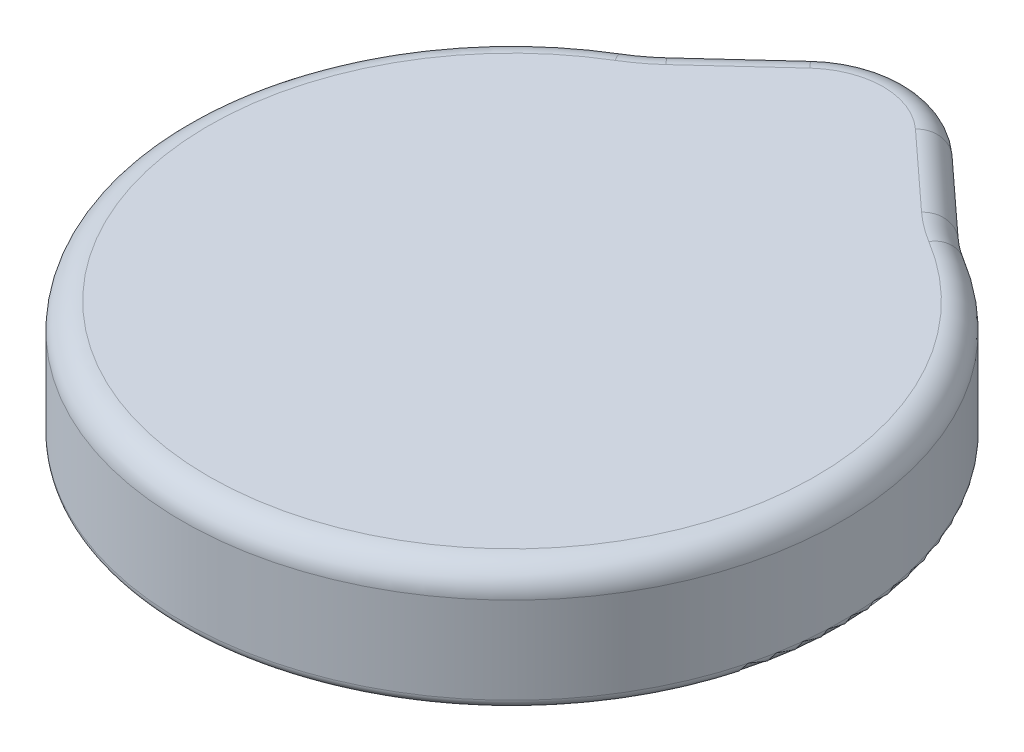
ISO-10303-21;
HEADER;
FILE_DESCRIPTION(('STEP AP214'),'2;1');
FILE_NAME('part.step','',(''),(''),'','','');
FILE_SCHEMA(('AUTOMOTIVE_DESIGN { 1 0 10303 214 1 1 1 1 }'));
ENDSEC;
DATA;
#1=APPLICATION_CONTEXT('core data for automotive mechanical design processes');
#2=APPLICATION_PROTOCOL_DEFINITION('international standard','automotive_design',2000,#1);
#3=PRODUCT_CONTEXT('',#1,'mechanical');
#4=PRODUCT('Part','Part','',(#3));
#5=PRODUCT_RELATED_PRODUCT_CATEGORY('part','',(#4));
#6=PRODUCT_DEFINITION_FORMATION('','',#4);
#7=PRODUCT_DEFINITION_CONTEXT('part definition',#1,'design');
#8=PRODUCT_DEFINITION('design','',#6,#7);
#9=PRODUCT_DEFINITION_SHAPE('','',#8);
#10=(LENGTH_UNIT() NAMED_UNIT(*) SI_UNIT(.MILLI.,.METRE.));
#11=(NAMED_UNIT(*) PLANE_ANGLE_UNIT() SI_UNIT($,.RADIAN.));
#12=(NAMED_UNIT(*) SI_UNIT($,.STERADIAN.) SOLID_ANGLE_UNIT());
#13=UNCERTAINTY_MEASURE_WITH_UNIT(LENGTH_MEASURE(1.E-05),#10,'distance_accuracy_value','');
#14=(GEOMETRIC_REPRESENTATION_CONTEXT(3) GLOBAL_UNCERTAINTY_ASSIGNED_CONTEXT((#13)) GLOBAL_UNIT_ASSIGNED_CONTEXT((#10,
#11,#12)) REPRESENTATION_CONTEXT('',''));
#15=CARTESIAN_POINT('',(0.,0.,0.));
#16=DIRECTION('',(0.,0.,1.));
#17=DIRECTION('',(1.,0.,0.));
#18=AXIS2_PLACEMENT_3D('',#15,#16,#17);
#19=CARTESIAN_POINT('',(-28.9407875302166,-10.,-47.9419525794565));
#20=DIRECTION('',(0.,1.,0.));
#21=DIRECTION('',(0.,0.,1.));
#22=AXIS2_PLACEMENT_3D('',#19,#20,#21);
#23=CYLINDRICAL_SURFACE('',#22,18.);
#24=DIRECTION('',(0.,1.,0.));
#25=VECTOR('',#24,1.);
#26=CARTESIAN_POINT('',(-16.7643043523353,-10.,-34.6855104693437));
#27=LINE('',#26,#25);
#28=CARTESIAN_POINT('',(-16.7643043523353,-9.,-34.6855104693437));
#29=VERTEX_POINT('',#28);
#30=CARTESIAN_POINT('',(-16.7643043523353,0.999999999999999,-34.6855104693437));
#31=VERTEX_POINT('',#30);
#32=EDGE_CURVE('E292',#29,#31,#27,.T.);
#33=ORIENTED_EDGE('',*,*,#32,.F.);
#34=CARTESIAN_POINT('',(-28.9407875302166,-9.,-47.9419525794565));
#35=DIRECTION('',(0.,1.,0.));
#36=DIRECTION('',(0.,0.,1.));
#37=AXIS2_PLACEMENT_3D('',#34,#35,#36);
#38=CIRCLE('',#37,18.);
#39=CARTESIAN_POINT('',(-19.6383915383613,-9.,-32.5320392503455));
#40=VERTEX_POINT('',#39);
#41=EDGE_CURVE('E218',#29,#40,#38,.F.);
#42=ORIENTED_EDGE('',*,*,#41,.T.);
#43=DIRECTION('',(0.,1.,0.));
#44=VECTOR('',#43,1.);
#45=CARTESIAN_POINT('',(-19.6383915383613,-10.,-32.5320392503455));
#46=LINE('',#45,#44);
#47=CARTESIAN_POINT('',(-19.6383915383613,0.999999999999999,-32.5320392503455));
#48=VERTEX_POINT('',#47);
#49=EDGE_CURVE('E312',#40,#48,#46,.T.);
#50=ORIENTED_EDGE('',*,*,#49,.T.);
#51=CARTESIAN_POINT('',(-28.9407875302166,0.999999999999999,-47.9419525794565));
#52=DIRECTION('',(0.,1.,0.));
#53=DIRECTION('',(0.,0.,1.));
#54=AXIS2_PLACEMENT_3D('',#51,#52,#53);
#55=CIRCLE('',#54,18.);
#56=EDGE_CURVE('E298',#48,#31,#55,.T.);
#57=ORIENTED_EDGE('',*,*,#56,.T.);
#58=EDGE_LOOP('',(#33,#42,#50,#57));
#59=FACE_BOUND('',#58,.T.);
#60=ADVANCED_FACE('F37',(#59),#23,.F.);
#61=CARTESIAN_POINT('',(-8.1176554519209,-10.,-42.627745196158));
#62=DIRECTION('',(-0.676471287660074,0.,-0.73646900611738));
#63=DIRECTION('',(-0.73646900611738,0.,0.676471287660074));
#64=AXIS2_PLACEMENT_3D('',#61,#62,#63);
#65=PLANE('',#64);
#66=DIRECTION('',(0.,1.,0.));
#67=VECTOR('',#66,1.);
#68=CARTESIAN_POINT('',(-8.11765545192091,-10.,-42.627745196158));
#69=LINE('',#68,#67);
#70=CARTESIAN_POINT('',(-8.11765545192091,-9.,-42.627745196158));
#71=VERTEX_POINT('',#70);
#72=CARTESIAN_POINT('',(-8.11765545192091,0.999999999999999,-42.627745196158));
#73=VERTEX_POINT('',#72);
#74=EDGE_CURVE('E206',#71,#73,#69,.T.);
#75=ORIENTED_EDGE('',*,*,#74,.F.);
#76=DIRECTION('',(-0.73646900611738,0.,0.676471287660074));
#77=VECTOR('',#76,1.);
#78=CARTESIAN_POINT('',(-16.7643043523353,-9.,-34.6855104693437));
#79=LINE('',#78,#77);
#80=EDGE_CURVE('E216',#71,#29,#79,.T.);
#81=ORIENTED_EDGE('',*,*,#80,.T.);
#82=ORIENTED_EDGE('',*,*,#32,.T.);
#83=DIRECTION('',(-0.73646900611738,0.,0.676471287660074));
#84=VECTOR('',#83,1.);
#85=CARTESIAN_POINT('',(-8.1176554519209,0.999999999999999,-42.627745196158));
#86=LINE('',#85,#84);
#87=EDGE_CURVE('E372',#31,#73,#86,.F.);
#88=ORIENTED_EDGE('',*,*,#87,.T.);
#89=EDGE_LOOP('',(#75,#81,#82,#88));
#90=FACE_BOUND('',#89,.T.);
#91=ADVANCED_FACE('F290',(#90),#65,.T.);
#92=CARTESIAN_POINT('',(0.,-10.,-33.7901171227495));
#93=DIRECTION('',(0.,1.,0.));
#94=DIRECTION('',(0.,0.,1.));
#95=AXIS2_PLACEMENT_3D('',#92,#93,#94);
#96=CYLINDRICAL_SURFACE('',#95,12.);
#97=DIRECTION('',(0.,1.,0.));
#98=VECTOR('',#97,1.);
#99=CARTESIAN_POINT('',(8.11765545192089,-10.,-42.627745196158));
#100=LINE('',#99,#98);
#101=CARTESIAN_POINT('',(8.11765545192089,-9.,-42.627745196158));
#102=VERTEX_POINT('',#101);
#103=CARTESIAN_POINT('',(8.11765545192089,0.999999999999999,-42.627745196158));
#104=VERTEX_POINT('',#103);
#105=EDGE_CURVE('E194',#102,#104,#100,.T.);
#106=ORIENTED_EDGE('',*,*,#105,.F.);
#107=CARTESIAN_POINT('',(0.,-9.,-33.7901171227495));
#108=DIRECTION('',(0.,1.,0.));
#109=DIRECTION('',(0.,0.,1.));
#110=AXIS2_PLACEMENT_3D('',#107,#108,#109);
#111=CIRCLE('',#110,12.);
#112=EDGE_CURVE('E198',#102,#71,#111,.T.);
#113=ORIENTED_EDGE('',*,*,#112,.T.);
#114=ORIENTED_EDGE('',*,*,#74,.T.);
#115=CARTESIAN_POINT('',(0.,0.999999999999999,-33.7901171227495));
#116=DIRECTION('',(0.,1.,0.));
#117=DIRECTION('',(0.,0.,1.));
#118=AXIS2_PLACEMENT_3D('',#115,#116,#117);
#119=CIRCLE('',#118,12.);
#120=EDGE_CURVE('E204',#73,#104,#119,.F.);
#121=ORIENTED_EDGE('',*,*,#120,.T.);
#122=EDGE_LOOP('',(#106,#113,#114,#121));
#123=FACE_BOUND('',#122,.T.);
#124=ADVANCED_FACE('F201',(#123),#96,.T.);
#125=CARTESIAN_POINT('',(8.11765545192089,-10.,-42.627745196158));
#126=DIRECTION('',(0.676471287660075,0.,-0.736469006117379));
#127=DIRECTION('',(-0.736469006117379,0.,-0.676471287660075));
#128=AXIS2_PLACEMENT_3D('',#125,#126,#127);
#129=PLANE('',#128);
#130=DIRECTION('',(0.,1.,0.));
#131=VECTOR('',#130,1.);
#132=CARTESIAN_POINT('',(16.7643043523352,-10.,-34.6855104693437));
#133=LINE('',#132,#131);
#134=CARTESIAN_POINT('',(16.7643043523352,-9.,-34.6855104693437));
#135=VERTEX_POINT('',#134);
#136=CARTESIAN_POINT('',(16.7643043523352,0.999999999999999,-34.6855104693437));
#137=VERTEX_POINT('',#136);
#138=EDGE_CURVE('E196',#135,#137,#133,.T.);
#139=ORIENTED_EDGE('',*,*,#138,.F.);
#140=DIRECTION('',(-0.736469006117379,0.,-0.676471287660075));
#141=VECTOR('',#140,1.);
#142=CARTESIAN_POINT('',(8.11765545192089,-9.,-42.627745196158));
#143=LINE('',#142,#141);
#144=EDGE_CURVE('E190',#135,#102,#143,.T.);
#145=ORIENTED_EDGE('',*,*,#144,.T.);
#146=ORIENTED_EDGE('',*,*,#105,.T.);
#147=DIRECTION('',(0.736469006117379,0.,0.676471287660075));
#148=VECTOR('',#147,1.);
#149=CARTESIAN_POINT('',(8.11765545192089,0.999999999999999,-42.627745196158));
#150=LINE('',#149,#148);
#151=EDGE_CURVE('E375',#104,#137,#150,.T.);
#152=ORIENTED_EDGE('',*,*,#151,.T.);
#153=EDGE_LOOP('',(#139,#145,#146,#152));
#154=FACE_BOUND('',#153,.T.);
#155=ADVANCED_FACE('F192',(#154),#129,.T.);
#156=CARTESIAN_POINT('',(28.9407875302166,-10.,-47.9419525794566));
#157=DIRECTION('',(0.,1.,0.));
#158=DIRECTION('',(0.,0.,1.));
#159=AXIS2_PLACEMENT_3D('',#156,#157,#158);
#160=CYLINDRICAL_SURFACE('',#159,18.);
#161=DIRECTION('',(0.,1.,0.));
#162=VECTOR('',#161,1.);
#163=CARTESIAN_POINT('',(19.6383915383612,-10.,-32.5320392503455));
#164=LINE('',#163,#162);
#165=CARTESIAN_POINT('',(19.6383915383612,-9.,-32.5320392503455));
#166=VERTEX_POINT('',#165);
#167=CARTESIAN_POINT('',(19.6383915383612,0.999999999999999,-32.5320392503455));
#168=VERTEX_POINT('',#167);
#169=EDGE_CURVE('E310',#166,#168,#164,.T.);
#170=ORIENTED_EDGE('',*,*,#169,.F.);
#171=CARTESIAN_POINT('',(28.9407875302166,-9.,-47.9419525794566));
#172=DIRECTION('',(0.,1.,0.));
#173=DIRECTION('',(0.,0.,1.));
#174=AXIS2_PLACEMENT_3D('',#171,#172,#173);
#175=CIRCLE('',#174,18.);
#176=EDGE_CURVE('E197',#166,#135,#175,.F.);
#177=ORIENTED_EDGE('',*,*,#176,.T.);
#178=ORIENTED_EDGE('',*,*,#138,.T.);
#179=CARTESIAN_POINT('',(28.9407875302166,0.999999999999999,-47.9419525794566));
#180=DIRECTION('',(0.,1.,0.));
#181=DIRECTION('',(0.,0.,1.));
#182=AXIS2_PLACEMENT_3D('',#179,#180,#181);
#183=CIRCLE('',#182,18.);
#184=EDGE_CURVE('E377',#137,#168,#183,.T.);
#185=ORIENTED_EDGE('',*,*,#184,.T.);
#186=EDGE_LOOP('',(#170,#177,#178,#185));
#187=FACE_BOUND('',#186,.T.);
#188=ADVANCED_FACE('F741',(#187),#160,.F.);
#189=CARTESIAN_POINT('',(0.,-10.,0.));
#190=DIRECTION('',(0.,1.,0.));
#191=DIRECTION('',(0.,0.,1.));
#192=AXIS2_PLACEMENT_3D('',#189,#190,#191);
#193=CYLINDRICAL_SURFACE('',#192,38.);
#194=ORIENTED_EDGE('',*,*,#49,.F.);
#195=CARTESIAN_POINT('',(0.,-9.,0.));
#196=DIRECTION('',(0.,1.,0.));
#197=DIRECTION('',(0.,0.,1.));
#198=AXIS2_PLACEMENT_3D('',#195,#196,#197);
#199=CIRCLE('',#198,38.);
#200=EDGE_CURVE('E11',#40,#166,#199,.T.);
#201=ORIENTED_EDGE('',*,*,#200,.T.);
#202=ORIENTED_EDGE('',*,*,#169,.T.);
#203=CARTESIAN_POINT('',(0.,0.999999999999999,0.));
#204=DIRECTION('',(0.,1.,0.));
#205=DIRECTION('',(0.,0.,1.));
#206=AXIS2_PLACEMENT_3D('',#203,#204,#205);
#207=CIRCLE('',#206,38.);
#208=EDGE_CURVE('E380',#168,#48,#207,.F.);
#209=ORIENTED_EDGE('',*,*,#208,.T.);
#210=EDGE_LOOP('',(#194,#201,#202,#209));
#211=FACE_BOUND('',#210,.T.);
#212=ADVANCED_FACE('F482',(#211),#193,.T.);
#213=CARTESIAN_POINT('',(28.9407875302166,-10.,-47.9419525794566));
#214=DIRECTION('',(0.,1.,0.));
#215=DIRECTION('',(0.,0.,1.));
#216=AXIS2_PLACEMENT_3D('',#213,#214,#215);
#217=CYLINDRICAL_SURFACE('',#216,20.);
#218=DIRECTION('',(0.,1.,0.));
#219=VECTOR('',#218,1.);
#220=CARTESIAN_POINT('',(15.4113617770151,-10.,-33.212572457109));
#221=LINE('',#220,#219);
#222=CARTESIAN_POINT('',(15.4113617770151,-9.,-33.212572457109));
#223=VERTEX_POINT('',#222);
#224=CARTESIAN_POINT('',(15.4113617770151,-0.999999999999999,-33.212572457109));
#225=VERTEX_POINT('',#224);
#226=EDGE_CURVE('E306',#223,#225,#221,.T.);
#227=ORIENTED_EDGE('',*,*,#226,.F.);
#228=CARTESIAN_POINT('',(28.9407875302166,-9.,-47.9419525794566));
#229=DIRECTION('',(0.,1.,0.));
#230=DIRECTION('',(0.,0.,1.));
#231=AXIS2_PLACEMENT_3D('',#228,#229,#230);
#232=CIRCLE('',#231,20.);
#233=CARTESIAN_POINT('',(18.6047919837106,-9.,-30.8198266582221));
#234=VERTEX_POINT('',#233);
#235=EDGE_CURVE('E275',#223,#234,#232,.T.);
#236=ORIENTED_EDGE('',*,*,#235,.T.);
#237=DIRECTION('',(0.,1.,0.));
#238=VECTOR('',#237,1.);
#239=CARTESIAN_POINT('',(18.6047919837106,-10.,-30.8198266582221));
#240=LINE('',#239,#238);
#241=CARTESIAN_POINT('',(18.6047919837106,-0.999999999999999,-30.8198266582221));
#242=VERTEX_POINT('',#241);
#243=EDGE_CURVE('E313',#234,#242,#240,.T.);
#244=ORIENTED_EDGE('',*,*,#243,.T.);
#245=CARTESIAN_POINT('',(28.9407875302166,-0.999999999999999,-47.9419525794566));
#246=DIRECTION('',(0.,1.,0.));
#247=DIRECTION('',(0.,0.,1.));
#248=AXIS2_PLACEMENT_3D('',#245,#246,#247);
#249=CIRCLE('',#248,20.);
#250=EDGE_CURVE('E336',#242,#225,#249,.F.);
#251=ORIENTED_EDGE('',*,*,#250,.T.);
#252=EDGE_LOOP('',(#227,#236,#244,#251));
#253=FACE_BOUND('',#252,.T.);
#254=ADVANCED_FACE('F408',(#253),#217,.T.);
#255=CARTESIAN_POINT('',(0.,-10.,0.));
#256=DIRECTION('',(0.,1.,0.));
#257=DIRECTION('',(0.,0.,1.));
#258=AXIS2_PLACEMENT_3D('',#255,#256,#257);
#259=CYLINDRICAL_SURFACE('',#258,36.);
#260=ORIENTED_EDGE('',*,*,#243,.F.);
#261=CARTESIAN_POINT('',(0.,-9.,0.));
#262=DIRECTION('',(0.,1.,0.));
#263=DIRECTION('',(0.,0.,1.));
#264=AXIS2_PLACEMENT_3D('',#261,#262,#263);
#265=CIRCLE('',#264,36.);
#266=CARTESIAN_POINT('',(-18.6047919837107,-9.,-30.819826658222));
#267=VERTEX_POINT('',#266);
#268=EDGE_CURVE('E47',#234,#267,#265,.F.);
#269=ORIENTED_EDGE('',*,*,#268,.T.);
#270=DIRECTION('',(0.,1.,0.));
#271=VECTOR('',#270,1.);
#272=CARTESIAN_POINT('',(-18.6047919837107,-10.,-30.819826658222));
#273=LINE('',#272,#271);
#274=CARTESIAN_POINT('',(-18.6047919837107,-0.999999999999999,-30.819826658222));
#275=VERTEX_POINT('',#274);
#276=EDGE_CURVE('E92',#267,#275,#273,.T.);
#277=ORIENTED_EDGE('',*,*,#276,.T.);
#278=CARTESIAN_POINT('',(0.,-0.999999999999999,0.));
#279=DIRECTION('',(0.,1.,0.));
#280=DIRECTION('',(0.,0.,1.));
#281=AXIS2_PLACEMENT_3D('',#278,#279,#280);
#282=CIRCLE('',#281,36.);
#283=EDGE_CURVE('E339',#275,#242,#282,.T.);
#284=ORIENTED_EDGE('',*,*,#283,.T.);
#285=EDGE_LOOP('',(#260,#269,#277,#284));
#286=FACE_BOUND('',#285,.T.);
#287=ADVANCED_FACE('F409',(#286),#259,.F.);
#288=CARTESIAN_POINT('',(-28.9407875302166,-10.,-47.9419525794565));
#289=DIRECTION('',(0.,1.,0.));
#290=DIRECTION('',(0.,0.,1.));
#291=AXIS2_PLACEMENT_3D('',#288,#289,#290);
#292=CYLINDRICAL_SURFACE('',#291,20.);
#293=ORIENTED_EDGE('',*,*,#276,.F.);
#294=CARTESIAN_POINT('',(-28.9407875302166,-9.,-47.9419525794565));
#295=DIRECTION('',(0.,1.,0.));
#296=DIRECTION('',(0.,0.,1.));
#297=AXIS2_PLACEMENT_3D('',#294,#295,#296);
#298=CIRCLE('',#297,20.);
#299=CARTESIAN_POINT('',(-15.4113617770151,-9.,-33.2125724571089));
#300=VERTEX_POINT('',#299);
#301=EDGE_CURVE('E383',#267,#300,#298,.T.);
#302=ORIENTED_EDGE('',*,*,#301,.T.);
#303=DIRECTION('',(0.,1.,0.));
#304=VECTOR('',#303,1.);
#305=CARTESIAN_POINT('',(-15.4113617770151,-10.,-33.2125724571089));
#306=LINE('',#305,#304);
#307=CARTESIAN_POINT('',(-15.4113617770151,-0.999999999999999,-33.2125724571089));
#308=VERTEX_POINT('',#307);
#309=EDGE_CURVE('E426',#300,#308,#306,.T.);
#310=ORIENTED_EDGE('',*,*,#309,.T.);
#311=CARTESIAN_POINT('',(-28.9407875302166,-0.999999999999999,-47.9419525794565));
#312=DIRECTION('',(0.,1.,0.));
#313=DIRECTION('',(0.,0.,1.));
#314=AXIS2_PLACEMENT_3D('',#311,#312,#313);
#315=CIRCLE('',#314,20.);
#316=EDGE_CURVE('E299',#308,#275,#315,.F.);
#317=ORIENTED_EDGE('',*,*,#316,.T.);
#318=EDGE_LOOP('',(#293,#302,#310,#317));
#319=FACE_BOUND('',#318,.T.);
#320=ADVANCED_FACE('F425',(#319),#292,.T.);
#321=CARTESIAN_POINT('',(-6.76471287660075,-10.,-41.1548071839232));
#322=DIRECTION('',(-0.676471287660074,0.,-0.73646900611738));
#323=DIRECTION('',(-0.73646900611738,0.,0.676471287660074));
#324=AXIS2_PLACEMENT_3D('',#321,#322,#323);
#325=PLANE('',#324);
#326=ORIENTED_EDGE('',*,*,#309,.F.);
#327=DIRECTION('',(-0.73646900611738,0.,0.676471287660074));
#328=VECTOR('',#327,1.);
#329=CARTESIAN_POINT('',(-6.76471287660075,-9.,-41.1548071839232));
#330=LINE('',#329,#328);
#331=CARTESIAN_POINT('',(-6.76471287660075,-9.,-41.1548071839232));
#332=VERTEX_POINT('',#331);
#333=EDGE_CURVE('E400',#300,#332,#330,.F.);
#334=ORIENTED_EDGE('',*,*,#333,.T.);
#335=DIRECTION('',(0.,1.,0.));
#336=VECTOR('',#335,1.);
#337=CARTESIAN_POINT('',(-6.76471287660075,-10.,-41.1548071839232));
#338=LINE('',#337,#336);
#339=CARTESIAN_POINT('',(-6.76471287660075,-0.999999999999999,-41.1548071839232));
#340=VERTEX_POINT('',#339);
#341=EDGE_CURVE('E432',#332,#340,#338,.T.);
#342=ORIENTED_EDGE('',*,*,#341,.T.);
#343=DIRECTION('',(-0.73646900611738,0.,0.676471287660074));
#344=VECTOR('',#343,1.);
#345=CARTESIAN_POINT('',(-15.4113617770151,-0.999999999999999,-33.2125724571089));
#346=LINE('',#345,#344);
#347=EDGE_CURVE('E327',#340,#308,#346,.T.);
#348=ORIENTED_EDGE('',*,*,#347,.T.);
#349=EDGE_LOOP('',(#326,#334,#342,#348));
#350=FACE_BOUND('',#349,.T.);
#351=ADVANCED_FACE('F428',(#350),#325,.F.);
#352=CARTESIAN_POINT('',(0.,-10.,-33.7901171227495));
#353=DIRECTION('',(0.,1.,0.));
#354=DIRECTION('',(0.,0.,1.));
#355=AXIS2_PLACEMENT_3D('',#352,#353,#354);
#356=CYLINDRICAL_SURFACE('',#355,10.);
#357=ORIENTED_EDGE('',*,*,#341,.F.);
#358=CARTESIAN_POINT('',(0.,-9.,-33.7901171227495));
#359=DIRECTION('',(0.,1.,0.));
#360=DIRECTION('',(0.,0.,1.));
#361=AXIS2_PLACEMENT_3D('',#358,#359,#360);
#362=CIRCLE('',#361,10.);
#363=CARTESIAN_POINT('',(6.76471287660073,-9.,-41.1548071839232));
#364=VERTEX_POINT('',#363);
#365=EDGE_CURVE('E402',#332,#364,#362,.F.);
#366=ORIENTED_EDGE('',*,*,#365,.T.);
#367=DIRECTION('',(0.,1.,0.));
#368=VECTOR('',#367,1.);
#369=CARTESIAN_POINT('',(6.76471287660073,-10.,-41.1548071839232));
#370=LINE('',#369,#368);
#371=CARTESIAN_POINT('',(6.76471287660073,-0.999999999999999,-41.1548071839232));
#372=VERTEX_POINT('',#371);
#373=EDGE_CURVE('E435',#364,#372,#370,.T.);
#374=ORIENTED_EDGE('',*,*,#373,.T.);
#375=CARTESIAN_POINT('',(0.,-0.999999999999999,-33.7901171227495));
#376=DIRECTION('',(0.,1.,0.));
#377=DIRECTION('',(0.,0.,1.));
#378=AXIS2_PLACEMENT_3D('',#375,#376,#377);
#379=CIRCLE('',#378,10.);
#380=EDGE_CURVE('E330',#372,#340,#379,.T.);
#381=ORIENTED_EDGE('',*,*,#380,.T.);
#382=EDGE_LOOP('',(#357,#366,#374,#381));
#383=FACE_BOUND('',#382,.T.);
#384=ADVANCED_FACE('F460',(#383),#356,.F.);
#385=CARTESIAN_POINT('',(6.76471287660074,-10.,-41.1548071839232));
#386=DIRECTION('',(0.676471287660074,0.,-0.73646900611738));
#387=DIRECTION('',(-0.73646900611738,0.,-0.676471287660074));
#388=AXIS2_PLACEMENT_3D('',#385,#386,#387);
#389=PLANE('',#388);
#390=ORIENTED_EDGE('',*,*,#373,.F.);
#391=DIRECTION('',(-0.73646900611738,0.,-0.676471287660074));
#392=VECTOR('',#391,1.);
#393=CARTESIAN_POINT('',(6.76471287660074,-9.,-41.1548071839232));
#394=LINE('',#393,#392);
#395=EDGE_CURVE('E279',#364,#223,#394,.F.);
#396=ORIENTED_EDGE('',*,*,#395,.T.);
#397=ORIENTED_EDGE('',*,*,#226,.T.);
#398=DIRECTION('',(-0.73646900611738,0.,-0.676471287660074));
#399=VECTOR('',#398,1.);
#400=CARTESIAN_POINT('',(6.76471287660074,-0.999999999999999,-41.1548071839232));
#401=LINE('',#400,#399);
#402=EDGE_CURVE('E333',#225,#372,#401,.T.);
#403=ORIENTED_EDGE('',*,*,#402,.T.);
#404=EDGE_LOOP('',(#390,#396,#397,#403));
#405=FACE_BOUND('',#404,.T.);
#406=ADVANCED_FACE('F440',(#405),#389,.F.);
#407=CARTESIAN_POINT('',(-28.9407875302166,0.,-47.9419525794565));
#408=DIRECTION('',(0.,1.,0.));
#409=DIRECTION('',(0.,0.,1.));
#410=AXIS2_PLACEMENT_3D('',#407,#408,#409);
#411=PLANE('',#410);
#412=CARTESIAN_POINT('',(0.,0.,0.));
#413=DIRECTION('',(0.,1.,0.));
#414=DIRECTION('',(0.,0.,1.));
#415=AXIS2_PLACEMENT_3D('',#412,#413,#414);
#416=CIRCLE('',#415,35.);
#417=CARTESIAN_POINT('',(18.0879922063854,0.,-29.9637203621603));
#418=VERTEX_POINT('',#417);
#419=CARTESIAN_POINT('',(-18.0879922063854,0.,-29.9637203621603));
#420=VERTEX_POINT('',#419);
#421=EDGE_CURVE('E302',#418,#420,#416,.F.);
#422=ORIENTED_EDGE('',*,*,#421,.T.);
#423=CARTESIAN_POINT('',(-28.9407875302166,0.,-47.9419525794565));
#424=DIRECTION('',(0.,1.,0.));
#425=DIRECTION('',(0.,0.,1.));
#426=AXIS2_PLACEMENT_3D('',#423,#424,#425);
#427=CIRCLE('',#426,21.);
#428=CARTESIAN_POINT('',(-14.7348904893551,0.,-32.4761034509915));
#429=VERTEX_POINT('',#428);
#430=EDGE_CURVE('E324',#420,#429,#427,.T.);
#431=ORIENTED_EDGE('',*,*,#430,.T.);
#432=DIRECTION('',(-0.73646900611738,0.,0.676471287660074));
#433=VECTOR('',#432,1.);
#434=CARTESIAN_POINT('',(-6.08824158894067,0.,-40.4183381778059));
#435=LINE('',#434,#433);
#436=CARTESIAN_POINT('',(-6.08824158894067,0.,-40.4183381778059));
#437=VERTEX_POINT('',#436);
#438=EDGE_CURVE('E322',#429,#437,#435,.F.);
#439=ORIENTED_EDGE('',*,*,#438,.T.);
#440=CARTESIAN_POINT('',(0.,0.,-33.7901171227495));
#441=DIRECTION('',(0.,1.,0.));
#442=DIRECTION('',(0.,0.,1.));
#443=AXIS2_PLACEMENT_3D('',#440,#441,#442);
#444=CIRCLE('',#443,9.);
#445=CARTESIAN_POINT('',(6.08824158894066,0.,-40.4183381778059));
#446=VERTEX_POINT('',#445);
#447=EDGE_CURVE('E320',#437,#446,#444,.F.);
#448=ORIENTED_EDGE('',*,*,#447,.T.);
#449=DIRECTION('',(-0.73646900611738,0.,-0.676471287660074));
#450=VECTOR('',#449,1.);
#451=CARTESIAN_POINT('',(14.734890489355,0.,-32.4761034509916));
#452=LINE('',#451,#450);
#453=CARTESIAN_POINT('',(14.734890489355,0.,-32.4761034509916));
#454=VERTEX_POINT('',#453);
#455=EDGE_CURVE('E318',#446,#454,#452,.F.);
#456=ORIENTED_EDGE('',*,*,#455,.T.);
#457=CARTESIAN_POINT('',(28.9407875302166,0.,-47.9419525794566));
#458=DIRECTION('',(0.,1.,0.));
#459=DIRECTION('',(0.,0.,1.));
#460=AXIS2_PLACEMENT_3D('',#457,#458,#459);
#461=CIRCLE('',#460,21.);
#462=EDGE_CURVE('E316',#454,#418,#461,.T.);
#463=ORIENTED_EDGE('',*,*,#462,.T.);
#464=EDGE_LOOP('',(#422,#431,#439,#448,#456,#463));
#465=FACE_BOUND('',#464,.T.);
#466=ADVANCED_FACE('F454',(#465),#411,.F.);
#467=CARTESIAN_POINT('',(-28.9407875302166,4.,-47.9419525794565));
#468=DIRECTION('',(0.,1.,0.));
#469=DIRECTION('',(0.,0.,1.));
#470=AXIS2_PLACEMENT_3D('',#467,#468,#469);
#471=PLANE('',#470);
#472=DIRECTION('',(-0.73646900611738,0.,0.676471287660074));
#473=VECTOR('',#472,1.);
#474=CARTESIAN_POINT('',(-14.7348904893551,4.,-32.4761034509915));
#475=LINE('',#474,#473);
#476=CARTESIAN_POINT('',(-6.08824158894068,4.,-40.4183381778059));
#477=VERTEX_POINT('',#476);
#478=CARTESIAN_POINT('',(-14.7348904893551,4.,-32.4761034509915));
#479=VERTEX_POINT('',#478);
#480=EDGE_CURVE('E367',#477,#479,#475,.T.);
#481=ORIENTED_EDGE('',*,*,#480,.T.);
#482=CARTESIAN_POINT('',(-28.9407875302166,4.,-47.9419525794565));
#483=DIRECTION('',(0.,1.,0.));
#484=DIRECTION('',(0.,0.,1.));
#485=AXIS2_PLACEMENT_3D('',#482,#483,#484);
#486=CIRCLE('',#485,21.);
#487=CARTESIAN_POINT('',(-18.0879922063854,4.,-29.9637203621603));
#488=VERTEX_POINT('',#487);
#489=EDGE_CURVE('E369',#479,#488,#486,.F.);
#490=ORIENTED_EDGE('',*,*,#489,.T.);
#491=CARTESIAN_POINT('',(0.,4.,0.));
#492=DIRECTION('',(0.,1.,0.));
#493=DIRECTION('',(0.,0.,1.));
#494=AXIS2_PLACEMENT_3D('',#491,#492,#493);
#495=CIRCLE('',#494,35.);
#496=CARTESIAN_POINT('',(18.0879922063854,4.,-29.9637203621603));
#497=VERTEX_POINT('',#496);
#498=EDGE_CURVE('E359',#488,#497,#495,.T.);
#499=ORIENTED_EDGE('',*,*,#498,.T.);
#500=CARTESIAN_POINT('',(28.9407875302166,4.,-47.9419525794566));
#501=DIRECTION('',(0.,1.,0.));
#502=DIRECTION('',(0.,0.,1.));
#503=AXIS2_PLACEMENT_3D('',#500,#501,#502);
#504=CIRCLE('',#503,21.);
#505=CARTESIAN_POINT('',(14.734890489355,4.,-32.4761034509916));
#506=VERTEX_POINT('',#505);
#507=EDGE_CURVE('E361',#497,#506,#504,.F.);
#508=ORIENTED_EDGE('',*,*,#507,.T.);
#509=DIRECTION('',(0.736469006117379,0.,0.676471287660075));
#510=VECTOR('',#509,1.);
#511=CARTESIAN_POINT('',(-16.659300035025,4.,-61.3127120695058));
#512=LINE('',#511,#510);
#513=CARTESIAN_POINT('',(6.08824158894066,4.,-40.4183381778059));
#514=VERTEX_POINT('',#513);
#515=EDGE_CURVE('E363',#506,#514,#512,.F.);
#516=ORIENTED_EDGE('',*,*,#515,.T.);
#517=CARTESIAN_POINT('',(0.,4.,-33.7901171227495));
#518=DIRECTION('',(0.,1.,0.));
#519=DIRECTION('',(0.,0.,1.));
#520=AXIS2_PLACEMENT_3D('',#517,#518,#519);
#521=CIRCLE('',#520,9.);
#522=EDGE_CURVE('E365',#514,#477,#521,.T.);
#523=ORIENTED_EDGE('',*,*,#522,.T.);
#524=EDGE_LOOP('',(#481,#490,#499,#508,#516,#523));
#525=FACE_BOUND('',#524,.T.);
#526=ADVANCED_FACE('F503',(#525),#471,.T.);
#527=CARTESIAN_POINT('',(6.08824158894066,-0.999999999999999,-40.4183381778059));
#528=DIRECTION('',(0.73646900611738,0.,0.676471287660074));
#529=DIRECTION('',(0.676471287660074,0.,-0.73646900611738));
#530=AXIS2_PLACEMENT_3D('',#527,#528,#529);
#531=CYLINDRICAL_SURFACE('',#530,1.);
#532=CARTESIAN_POINT('',(14.734890489355,-1.,-32.4761034509916));
#533=DIRECTION('',(-0.73646900611738,0.,-0.676471287660074));
#534=DIRECTION('',(-0.676471287660074,0.,0.73646900611738));
#535=AXIS2_PLACEMENT_3D('',#532,#533,#534);
#536=CIRCLE('',#535,1.);
#537=EDGE_CURVE('E352',#454,#225,#536,.T.);
#538=ORIENTED_EDGE('',*,*,#537,.F.);
#539=ORIENTED_EDGE('',*,*,#455,.F.);
#540=CARTESIAN_POINT('',(6.08824158894066,-0.999999999999999,-40.4183381778059));
#541=DIRECTION('',(0.73646900611738,0.,0.676471287660074));
#542=DIRECTION('',(0.676471287660074,0.,-0.73646900611738));
#543=AXIS2_PLACEMENT_3D('',#540,#541,#542);
#544=CIRCLE('',#543,1.);
#545=EDGE_CURVE('E355',#372,#446,#544,.T.);
#546=ORIENTED_EDGE('',*,*,#545,.F.);
#547=ORIENTED_EDGE('',*,*,#402,.F.);
#548=EDGE_LOOP('',(#538,#539,#546,#547));
#549=FACE_BOUND('',#548,.T.);
#550=ADVANCED_FACE('F447',(#549),#531,.F.);
#551=CARTESIAN_POINT('',(0.,-0.999999999999999,-33.7901171227495));
#552=DIRECTION('',(0.,1.,0.));
#553=DIRECTION('',(0.,0.,1.));
#554=AXIS2_PLACEMENT_3D('',#551,#552,#553);
#555=TOROIDAL_SURFACE('',#554,9.,1.);
#556=ORIENTED_EDGE('',*,*,#545,.T.);
#557=ORIENTED_EDGE('',*,*,#447,.F.);
#558=CARTESIAN_POINT('',(-6.08824158894068,-0.999999999999999,-40.4183381778059));
#559=DIRECTION('',(0.73646900611738,0.,-0.676471287660074));
#560=DIRECTION('',(-0.676471287660074,0.,-0.73646900611738));
#561=AXIS2_PLACEMENT_3D('',#558,#559,#560);
#562=CIRCLE('',#561,1.);
#563=EDGE_CURVE('E349',#340,#437,#562,.T.);
#564=ORIENTED_EDGE('',*,*,#563,.F.);
#565=ORIENTED_EDGE('',*,*,#380,.F.);
#566=EDGE_LOOP('',(#556,#557,#564,#565));
#567=FACE_BOUND('',#566,.T.);
#568=ADVANCED_FACE('F458',(#567),#555,.F.);
#569=CARTESIAN_POINT('',(28.9407875302166,-0.999999999999999,-47.9419525794566));
#570=DIRECTION('',(0.,1.,0.));
#571=DIRECTION('',(0.,0.,1.));
#572=AXIS2_PLACEMENT_3D('',#569,#570,#571);
#573=TOROIDAL_SURFACE('',#572,21.,1.);
#574=ORIENTED_EDGE('',*,*,#537,.T.);
#575=ORIENTED_EDGE('',*,*,#250,.F.);
#576=CARTESIAN_POINT('',(18.0879922063854,-1.,-29.9637203621603));
#577=DIRECTION('',(-0.856106296061725,0.,-0.516799777325295));
#578=DIRECTION('',(-0.516799777325295,0.,0.856106296061725));
#579=AXIS2_PLACEMENT_3D('',#576,#577,#578);
#580=CIRCLE('',#579,1.);
#581=EDGE_CURVE('E346',#418,#242,#580,.T.);
#582=ORIENTED_EDGE('',*,*,#581,.F.);
#583=ORIENTED_EDGE('',*,*,#462,.F.);
#584=EDGE_LOOP('',(#574,#575,#582,#583));
#585=FACE_BOUND('',#584,.T.);
#586=ADVANCED_FACE('F451',(#585),#573,.F.);
#587=CARTESIAN_POINT('',(-6.08824158894068,-0.999999999999999,-40.4183381778059));
#588=DIRECTION('',(0.73646900611738,0.,-0.676471287660074));
#589=DIRECTION('',(-0.676471287660074,0.,-0.73646900611738));
#590=AXIS2_PLACEMENT_3D('',#587,#588,#589);
#591=CYLINDRICAL_SURFACE('',#590,1.);
#592=ORIENTED_EDGE('',*,*,#563,.T.);
#593=ORIENTED_EDGE('',*,*,#438,.F.);
#594=CARTESIAN_POINT('',(-14.7348904893551,-0.999999999999999,-32.4761034509915));
#595=DIRECTION('',(0.73646900611738,0.,-0.676471287660074));
#596=DIRECTION('',(-0.676471287660074,0.,-0.73646900611738));
#597=AXIS2_PLACEMENT_3D('',#594,#595,#596);
#598=CIRCLE('',#597,1.);
#599=EDGE_CURVE('E343',#308,#429,#598,.T.);
#600=ORIENTED_EDGE('',*,*,#599,.F.);
#601=ORIENTED_EDGE('',*,*,#347,.F.);
#602=EDGE_LOOP('',(#592,#593,#600,#601));
#603=FACE_BOUND('',#602,.T.);
#604=ADVANCED_FACE('F492',(#603),#591,.F.);
#605=CARTESIAN_POINT('',(0.,-0.999999999999999,0.));
#606=DIRECTION('',(0.,1.,0.));
#607=DIRECTION('',(0.,0.,1.));
#608=AXIS2_PLACEMENT_3D('',#605,#606,#607);
#609=TOROIDAL_SURFACE('',#608,35.,1.);
#610=ORIENTED_EDGE('',*,*,#581,.T.);
#611=ORIENTED_EDGE('',*,*,#283,.F.);
#612=CARTESIAN_POINT('',(-18.0879922063854,-1.,-29.9637203621603));
#613=DIRECTION('',(-0.856106296061724,0.,0.516799777325297));
#614=DIRECTION('',(0.516799777325297,0.,0.856106296061724));
#615=AXIS2_PLACEMENT_3D('',#612,#613,#614);
#616=CIRCLE('',#615,1.);
#617=EDGE_CURVE('E341',#420,#275,#616,.T.);
#618=ORIENTED_EDGE('',*,*,#617,.F.);
#619=ORIENTED_EDGE('',*,*,#421,.F.);
#620=EDGE_LOOP('',(#610,#611,#618,#619));
#621=FACE_BOUND('',#620,.T.);
#622=ADVANCED_FACE('F488',(#621),#609,.F.);
#623=CARTESIAN_POINT('',(-28.9407875302166,-0.999999999999999,-47.9419525794565));
#624=DIRECTION('',(0.,1.,0.));
#625=DIRECTION('',(0.,0.,1.));
#626=AXIS2_PLACEMENT_3D('',#623,#624,#625);
#627=TOROIDAL_SURFACE('',#626,21.,1.);
#628=ORIENTED_EDGE('',*,*,#599,.T.);
#629=ORIENTED_EDGE('',*,*,#430,.F.);
#630=ORIENTED_EDGE('',*,*,#617,.T.);
#631=ORIENTED_EDGE('',*,*,#316,.F.);
#632=EDGE_LOOP('',(#628,#629,#630,#631));
#633=FACE_BOUND('',#632,.T.);
#634=ADVANCED_FACE('F484',(#633),#627,.F.);
#635=CARTESIAN_POINT('',(6.08824158894066,0.999999999999999,-40.4183381778059));
#636=DIRECTION('',(0.736469006117379,0.,0.676471287660075));
#637=DIRECTION('',(0.676471287660075,0.,-0.736469006117379));
#638=AXIS2_PLACEMENT_3D('',#635,#636,#637);
#639=CYLINDRICAL_SURFACE('',#638,3.);
#640=CARTESIAN_POINT('',(6.08824158894066,1.,-40.4183381778059));
#641=DIRECTION('',(-0.736469006117379,0.,-0.676471287660075));
#642=DIRECTION('',(-0.676471287660075,0.,0.736469006117379));
#643=AXIS2_PLACEMENT_3D('',#640,#641,#642);
#644=CIRCLE('',#643,3.);
#645=EDGE_CURVE('E393',#514,#104,#644,.T.);
#646=ORIENTED_EDGE('',*,*,#645,.F.);
#647=ORIENTED_EDGE('',*,*,#515,.F.);
#648=CARTESIAN_POINT('',(14.734890489355,0.999999999999999,-32.4761034509916));
#649=DIRECTION('',(0.736469006117379,0.,0.676471287660075));
#650=DIRECTION('',(0.676471287660075,0.,-0.736469006117379));
#651=AXIS2_PLACEMENT_3D('',#648,#649,#650);
#652=CIRCLE('',#651,3.);
#653=EDGE_CURVE('E344',#137,#506,#652,.T.);
#654=ORIENTED_EDGE('',*,*,#653,.F.);
#655=ORIENTED_EDGE('',*,*,#151,.F.);
#656=EDGE_LOOP('',(#646,#647,#654,#655));
#657=FACE_BOUND('',#656,.T.);
#658=ADVANCED_FACE('F487',(#657),#639,.T.);
#659=CARTESIAN_POINT('',(28.9407875302166,0.999999999999999,-47.9419525794566));
#660=DIRECTION('',(0.,1.,0.));
#661=DIRECTION('',(0.,0.,1.));
#662=AXIS2_PLACEMENT_3D('',#659,#660,#661);
#663=TOROIDAL_SURFACE('',#662,21.,3.);
#664=ORIENTED_EDGE('',*,*,#653,.T.);
#665=ORIENTED_EDGE('',*,*,#507,.F.);
#666=CARTESIAN_POINT('',(18.0879922063854,0.999999999999999,-29.9637203621603));
#667=DIRECTION('',(0.856106296061725,0.,0.516799777325295));
#668=DIRECTION('',(0.516799777325295,0.,-0.856106296061725));
#669=AXIS2_PLACEMENT_3D('',#666,#667,#668);
#670=CIRCLE('',#669,3.);
#671=EDGE_CURVE('E390',#168,#497,#670,.T.);
#672=ORIENTED_EDGE('',*,*,#671,.F.);
#673=ORIENTED_EDGE('',*,*,#184,.F.);
#674=EDGE_LOOP('',(#664,#665,#672,#673));
#675=FACE_BOUND('',#674,.T.);
#676=ADVANCED_FACE('F519',(#675),#663,.T.);
#677=CARTESIAN_POINT('',(0.,0.999999999999999,-33.7901171227495));
#678=DIRECTION('',(0.,1.,0.));
#679=DIRECTION('',(0.,0.,1.));
#680=AXIS2_PLACEMENT_3D('',#677,#678,#679);
#681=TOROIDAL_SURFACE('',#680,9.,3.);
#682=ORIENTED_EDGE('',*,*,#645,.T.);
#683=ORIENTED_EDGE('',*,*,#120,.F.);
#684=CARTESIAN_POINT('',(-6.08824158894068,1.,-40.4183381778059));
#685=DIRECTION('',(-0.736469006117379,0.,0.676471287660075));
#686=DIRECTION('',(0.676471287660075,0.,0.736469006117379));
#687=AXIS2_PLACEMENT_3D('',#684,#685,#686);
#688=CIRCLE('',#687,3.);
#689=EDGE_CURVE('E387',#477,#73,#688,.T.);
#690=ORIENTED_EDGE('',*,*,#689,.F.);
#691=ORIENTED_EDGE('',*,*,#522,.F.);
#692=EDGE_LOOP('',(#682,#683,#690,#691));
#693=FACE_BOUND('',#692,.T.);
#694=ADVANCED_FACE('F515',(#693),#681,.T.);
#695=CARTESIAN_POINT('',(0.,0.999999999999999,0.));
#696=DIRECTION('',(0.,1.,0.));
#697=DIRECTION('',(0.,0.,1.));
#698=AXIS2_PLACEMENT_3D('',#695,#696,#697);
#699=TOROIDAL_SURFACE('',#698,35.,3.);
#700=ORIENTED_EDGE('',*,*,#671,.T.);
#701=ORIENTED_EDGE('',*,*,#498,.F.);
#702=CARTESIAN_POINT('',(-18.0879922063854,0.999999999999999,-29.9637203621603));
#703=DIRECTION('',(0.856106296061724,0.,-0.516799777325297));
#704=DIRECTION('',(-0.516799777325297,0.,-0.856106296061724));
#705=AXIS2_PLACEMENT_3D('',#702,#703,#704);
#706=CIRCLE('',#705,3.);
#707=EDGE_CURVE('E385',#48,#488,#706,.T.);
#708=ORIENTED_EDGE('',*,*,#707,.F.);
#709=ORIENTED_EDGE('',*,*,#208,.F.);
#710=EDGE_LOOP('',(#700,#701,#708,#709));
#711=FACE_BOUND('',#710,.T.);
#712=ADVANCED_FACE('F511',(#711),#699,.T.);
#713=CARTESIAN_POINT('',(-14.7348904893551,1.,-32.4761034509915));
#714=DIRECTION('',(-0.73646900611738,0.,0.676471287660074));
#715=DIRECTION('',(0.676471287660074,0.,0.73646900611738));
#716=AXIS2_PLACEMENT_3D('',#713,#714,#715);
#717=CYLINDRICAL_SURFACE('',#716,3.);
#718=ORIENTED_EDGE('',*,*,#689,.T.);
#719=ORIENTED_EDGE('',*,*,#87,.F.);
#720=CARTESIAN_POINT('',(-14.7348904893551,1.,-32.4761034509915));
#721=DIRECTION('',(-0.736469006117379,0.,0.676471287660075));
#722=DIRECTION('',(0.676471287660075,0.,0.736469006117379));
#723=AXIS2_PLACEMENT_3D('',#720,#721,#722);
#724=CIRCLE('',#723,3.);
#725=EDGE_CURVE('E210',#479,#31,#724,.T.);
#726=ORIENTED_EDGE('',*,*,#725,.F.);
#727=ORIENTED_EDGE('',*,*,#480,.F.);
#728=EDGE_LOOP('',(#718,#719,#726,#727));
#729=FACE_BOUND('',#728,.T.);
#730=ADVANCED_FACE('F507',(#729),#717,.T.);
#731=CARTESIAN_POINT('',(-28.9407875302166,0.999999999999999,-47.9419525794565));
#732=DIRECTION('',(0.,1.,0.));
#733=DIRECTION('',(0.,0.,1.));
#734=AXIS2_PLACEMENT_3D('',#731,#732,#733);
#735=TOROIDAL_SURFACE('',#734,21.,3.);
#736=ORIENTED_EDGE('',*,*,#707,.T.);
#737=ORIENTED_EDGE('',*,*,#489,.F.);
#738=ORIENTED_EDGE('',*,*,#725,.T.);
#739=ORIENTED_EDGE('',*,*,#56,.F.);
#740=EDGE_LOOP('',(#736,#737,#738,#739));
#741=FACE_BOUND('',#740,.T.);
#742=ADVANCED_FACE('F504',(#741),#735,.T.);
#743=CARTESIAN_POINT('',(7.44118416426081,-9.,-41.8912761900406));
#744=DIRECTION('',(0.736469006117379,0.,0.676471287660075));
#745=DIRECTION('',(0.676471287660075,0.,-0.736469006117379));
#746=AXIS2_PLACEMENT_3D('',#743,#744,#745);
#747=CYLINDRICAL_SURFACE('',#746,1.);
#748=CARTESIAN_POINT('',(7.44118416426081,-9.,-41.8912761900406));
#749=DIRECTION('',(-0.73646900611738,0.,-0.676471287660074));
#750=DIRECTION('',(-0.676471287660074,0.,0.73646900611738));
#751=AXIS2_PLACEMENT_3D('',#748,#749,#750);
#752=CIRCLE('',#751,1.);
#753=CARTESIAN_POINT('',(7.44118416426081,-10.,-41.8912761900406));
#754=VERTEX_POINT('',#753);
#755=EDGE_CURVE('E41',#102,#754,#752,.T.);
#756=ORIENTED_EDGE('',*,*,#755,.F.);
#757=ORIENTED_EDGE('',*,*,#144,.F.);
#758=CARTESIAN_POINT('',(16.0878330646751,-9.,-33.9490414632263));
#759=DIRECTION('',(0.73646900611738,0.,0.676471287660074));
#760=DIRECTION('',(0.676471287660074,0.,-0.73646900611738));
#761=AXIS2_PLACEMENT_3D('',#758,#759,#760);
#762=CIRCLE('',#761,1.);
#763=CARTESIAN_POINT('',(16.0878330646751,-10.,-33.9490414632263));
#764=VERTEX_POINT('',#763);
#765=EDGE_CURVE('E78',#764,#135,#762,.T.);
#766=ORIENTED_EDGE('',*,*,#765,.F.);
#767=DIRECTION('',(-0.736469006117379,0.,-0.676471287660075));
#768=VECTOR('',#767,1.);
#769=CARTESIAN_POINT('',(16.0878330646751,-10.,-33.9490414632263));
#770=LINE('',#769,#768);
#771=EDGE_CURVE('E208',#754,#764,#770,.F.);
#772=ORIENTED_EDGE('',*,*,#771,.F.);
#773=EDGE_LOOP('',(#756,#757,#766,#772));
#774=FACE_BOUND('',#773,.T.);
#775=ADVANCED_FACE('F39',(#774),#747,.T.);
#776=CARTESIAN_POINT('',(0.,-9.,-33.7901171227495));
#777=DIRECTION('',(0.,1.,0.));
#778=DIRECTION('',(0.,0.,1.));
#779=AXIS2_PLACEMENT_3D('',#776,#777,#778);
#780=TOROIDAL_SURFACE('',#779,11.,1.);
#781=ORIENTED_EDGE('',*,*,#112,.F.);
#782=ORIENTED_EDGE('',*,*,#755,.T.);
#783=CARTESIAN_POINT('',(0.,-10.,-33.7901171227495));
#784=DIRECTION('',(0.,1.,0.));
#785=DIRECTION('',(0.,0.,1.));
#786=AXIS2_PLACEMENT_3D('',#783,#784,#785);
#787=CIRCLE('',#786,11.);
#788=CARTESIAN_POINT('',(-7.44118416426082,-10.,-41.8912761900406));
#789=VERTEX_POINT('',#788);
#790=EDGE_CURVE('E259',#789,#754,#787,.F.);
#791=ORIENTED_EDGE('',*,*,#790,.F.);
#792=CARTESIAN_POINT('',(-7.44118416426083,-9.,-41.8912761900406));
#793=DIRECTION('',(-0.73646900611738,0.,0.676471287660074));
#794=DIRECTION('',(0.676471287660074,0.,0.73646900611738));
#795=AXIS2_PLACEMENT_3D('',#792,#793,#794);
#796=CIRCLE('',#795,1.);
#797=EDGE_CURVE('E214',#71,#789,#796,.T.);
#798=ORIENTED_EDGE('',*,*,#797,.F.);
#799=EDGE_LOOP('',(#781,#782,#791,#798));
#800=FACE_BOUND('',#799,.T.);
#801=ADVANCED_FACE('F212',(#800),#780,.T.);
#802=CARTESIAN_POINT('',(28.9407875302166,-9.,-47.9419525794566));
#803=DIRECTION('',(0.,1.,0.));
#804=DIRECTION('',(0.,0.,1.));
#805=AXIS2_PLACEMENT_3D('',#802,#803,#804);
#806=TOROIDAL_SURFACE('',#805,19.,1.);
#807=ORIENTED_EDGE('',*,*,#765,.T.);
#808=ORIENTED_EDGE('',*,*,#176,.F.);
#809=CARTESIAN_POINT('',(19.1215917610359,-9.,-31.6759329542838));
#810=DIRECTION('',(0.856106296061725,0.,0.516799777325295));
#811=DIRECTION('',(0.516799777325295,0.,-0.856106296061725));
#812=AXIS2_PLACEMENT_3D('',#809,#810,#811);
#813=CIRCLE('',#812,1.);
#814=CARTESIAN_POINT('',(19.1215917610359,-10.,-31.6759329542838));
#815=VERTEX_POINT('',#814);
#816=EDGE_CURVE('E255',#815,#166,#813,.T.);
#817=ORIENTED_EDGE('',*,*,#816,.F.);
#818=CARTESIAN_POINT('',(28.9407875302166,-10.,-47.9419525794566));
#819=DIRECTION('',(0.,1.,0.));
#820=DIRECTION('',(0.,0.,1.));
#821=AXIS2_PLACEMENT_3D('',#818,#819,#820);
#822=CIRCLE('',#821,19.);
#823=EDGE_CURVE('E252',#764,#815,#822,.T.);
#824=ORIENTED_EDGE('',*,*,#823,.F.);
#825=EDGE_LOOP('',(#807,#808,#817,#824));
#826=FACE_BOUND('',#825,.T.);
#827=ADVANCED_FACE('F268',(#826),#806,.T.);
#828=CARTESIAN_POINT('',(-15.3063574597048,-9.,-62.7856500817406));
#829=DIRECTION('',(-0.73646900611738,0.,-0.676471287660074));
#830=DIRECTION('',(-0.676471287660074,0.,0.73646900611738));
#831=AXIS2_PLACEMENT_3D('',#828,#829,#830);
#832=CYLINDRICAL_SURFACE('',#831,1.);
#833=CARTESIAN_POINT('',(16.0878330646751,-9.,-33.9490414632263));
#834=DIRECTION('',(0.736469006117379,0.,0.676471287660075));
#835=DIRECTION('',(0.676471287660075,0.,-0.736469006117379));
#836=AXIS2_PLACEMENT_3D('',#833,#834,#835);
#837=CIRCLE('',#836,1.);
#838=EDGE_CURVE('E249',#223,#764,#837,.T.);
#839=ORIENTED_EDGE('',*,*,#838,.F.);
#840=ORIENTED_EDGE('',*,*,#395,.F.);
#841=CARTESIAN_POINT('',(7.44118416426081,-9.,-41.8912761900406));
#842=DIRECTION('',(-0.736469006117382,0.,-0.676471287660072));
#843=DIRECTION('',(-0.676471287660072,0.,0.736469006117382));
#844=AXIS2_PLACEMENT_3D('',#841,#842,#843);
#845=CIRCLE('',#844,1.);
#846=EDGE_CURVE('E262',#754,#364,#845,.T.);
#847=ORIENTED_EDGE('',*,*,#846,.F.);
#848=ORIENTED_EDGE('',*,*,#771,.T.);
#849=EDGE_LOOP('',(#839,#840,#847,#848));
#850=FACE_BOUND('',#849,.T.);
#851=ADVANCED_FACE('F278',(#850),#832,.T.);
#852=CARTESIAN_POINT('',(0.,-9.,-33.7901171227495));
#853=DIRECTION('',(0.,1.,0.));
#854=DIRECTION('',(0.,0.,1.));
#855=AXIS2_PLACEMENT_3D('',#852,#853,#854);
#856=TOROIDAL_SURFACE('',#855,11.,1.);
#857=ORIENTED_EDGE('',*,*,#846,.T.);
#858=ORIENTED_EDGE('',*,*,#365,.F.);
#859=CARTESIAN_POINT('',(-7.44118416426082,-9.,-41.8912761900406));
#860=DIRECTION('',(-0.73646900611738,0.,0.676471287660074));
#861=DIRECTION('',(0.676471287660074,0.,0.73646900611738));
#862=AXIS2_PLACEMENT_3D('',#859,#860,#861);
#863=CIRCLE('',#862,1.);
#864=EDGE_CURVE('E246',#789,#332,#863,.T.);
#865=ORIENTED_EDGE('',*,*,#864,.F.);
#866=ORIENTED_EDGE('',*,*,#790,.T.);
#867=EDGE_LOOP('',(#857,#858,#865,#866));
#868=FACE_BOUND('',#867,.T.);
#869=ADVANCED_FACE('F283',(#868),#856,.T.);
#870=CARTESIAN_POINT('',(-7.44118416426083,-9.,-41.8912761900406));
#871=DIRECTION('',(0.73646900611738,0.,-0.676471287660074));
#872=DIRECTION('',(-0.676471287660074,0.,-0.73646900611738));
#873=AXIS2_PLACEMENT_3D('',#870,#871,#872);
#874=CYLINDRICAL_SURFACE('',#873,1.);
#875=ORIENTED_EDGE('',*,*,#80,.F.);
#876=ORIENTED_EDGE('',*,*,#797,.T.);
#877=DIRECTION('',(-0.73646900611738,0.,0.676471287660074));
#878=VECTOR('',#877,1.);
#879=CARTESIAN_POINT('',(-7.44118416426083,-10.,-41.8912761900406));
#880=LINE('',#879,#878);
#881=CARTESIAN_POINT('',(-16.0878330646752,-10.,-33.9490414632263));
#882=VERTEX_POINT('',#881);
#883=EDGE_CURVE('E243',#882,#789,#880,.F.);
#884=ORIENTED_EDGE('',*,*,#883,.F.);
#885=CARTESIAN_POINT('',(-16.0878330646752,-9.,-33.9490414632263));
#886=DIRECTION('',(-0.73646900611738,0.,0.676471287660074));
#887=DIRECTION('',(0.676471287660074,0.,0.73646900611738));
#888=AXIS2_PLACEMENT_3D('',#885,#886,#887);
#889=CIRCLE('',#888,1.);
#890=EDGE_CURVE('E240',#29,#882,#889,.T.);
#891=ORIENTED_EDGE('',*,*,#890,.F.);
#892=EDGE_LOOP('',(#875,#876,#884,#891));
#893=FACE_BOUND('',#892,.T.);
#894=ADVANCED_FACE('F285',(#893),#874,.T.);
#895=CARTESIAN_POINT('',(0.,-9.,0.));
#896=DIRECTION('',(0.,1.,0.));
#897=DIRECTION('',(0.,0.,1.));
#898=AXIS2_PLACEMENT_3D('',#895,#896,#897);
#899=TOROIDAL_SURFACE('',#898,37.,1.);
#900=ORIENTED_EDGE('',*,*,#816,.T.);
#901=ORIENTED_EDGE('',*,*,#200,.F.);
#902=CARTESIAN_POINT('',(-19.121591761036,-9.,-31.6759329542838));
#903=DIRECTION('',(0.856106296061726,0.,-0.516799777325293));
#904=DIRECTION('',(-0.516799777325293,0.,-0.856106296061726));
#905=AXIS2_PLACEMENT_3D('',#902,#903,#904);
#906=CIRCLE('',#905,1.);
#907=CARTESIAN_POINT('',(-19.121591761036,-10.,-31.6759329542838));
#908=VERTEX_POINT('',#907);
#909=EDGE_CURVE('E238',#908,#40,#906,.T.);
#910=ORIENTED_EDGE('',*,*,#909,.F.);
#911=CARTESIAN_POINT('',(0.,-10.,0.));
#912=DIRECTION('',(0.,1.,0.));
#913=DIRECTION('',(0.,0.,1.));
#914=AXIS2_PLACEMENT_3D('',#911,#912,#913);
#915=CIRCLE('',#914,37.);
#916=EDGE_CURVE('E235',#815,#908,#915,.F.);
#917=ORIENTED_EDGE('',*,*,#916,.F.);
#918=EDGE_LOOP('',(#900,#901,#910,#917));
#919=FACE_BOUND('',#918,.T.);
#920=ADVANCED_FACE('F472',(#919),#899,.T.);
#921=CARTESIAN_POINT('',(28.9407875302166,-9.,-47.9419525794566));
#922=DIRECTION('',(0.,1.,0.));
#923=DIRECTION('',(0.,0.,1.));
#924=AXIS2_PLACEMENT_3D('',#921,#922,#923);
#925=TOROIDAL_SURFACE('',#924,19.,1.);
#926=ORIENTED_EDGE('',*,*,#838,.T.);
#927=ORIENTED_EDGE('',*,*,#823,.T.);
#928=CARTESIAN_POINT('',(19.121591761036,-9.,-31.6759329542838));
#929=DIRECTION('',(0.856106296061724,0.,0.516799777325297));
#930=DIRECTION('',(0.516799777325297,0.,-0.856106296061724));
#931=AXIS2_PLACEMENT_3D('',#928,#929,#930);
#932=CIRCLE('',#931,1.);
#933=EDGE_CURVE('E232',#234,#815,#932,.T.);
#934=ORIENTED_EDGE('',*,*,#933,.F.);
#935=ORIENTED_EDGE('',*,*,#235,.F.);
#936=EDGE_LOOP('',(#926,#927,#934,#935));
#937=FACE_BOUND('',#936,.T.);
#938=ADVANCED_FACE('F274',(#937),#925,.T.);
#939=CARTESIAN_POINT('',(-16.0878330646752,-9.,-33.9490414632263));
#940=DIRECTION('',(-0.73646900611738,0.,0.676471287660074));
#941=DIRECTION('',(0.676471287660074,0.,0.73646900611738));
#942=AXIS2_PLACEMENT_3D('',#939,#940,#941);
#943=CYLINDRICAL_SURFACE('',#942,1.);
#944=ORIENTED_EDGE('',*,*,#864,.T.);
#945=ORIENTED_EDGE('',*,*,#333,.F.);
#946=CARTESIAN_POINT('',(-16.0878330646752,-9.,-33.9490414632263));
#947=DIRECTION('',(-0.73646900611738,0.,0.676471287660074));
#948=DIRECTION('',(0.676471287660074,0.,0.73646900611738));
#949=AXIS2_PLACEMENT_3D('',#946,#947,#948);
#950=CIRCLE('',#949,1.);
#951=EDGE_CURVE('E230',#882,#300,#950,.T.);
#952=ORIENTED_EDGE('',*,*,#951,.F.);
#953=ORIENTED_EDGE('',*,*,#883,.T.);
#954=EDGE_LOOP('',(#944,#945,#952,#953));
#955=FACE_BOUND('',#954,.T.);
#956=ADVANCED_FACE('F462',(#955),#943,.T.);
#957=CARTESIAN_POINT('',(-28.9407875302166,-9.,-47.9419525794565));
#958=DIRECTION('',(0.,1.,0.));
#959=DIRECTION('',(0.,0.,1.));
#960=AXIS2_PLACEMENT_3D('',#957,#958,#959);
#961=TOROIDAL_SURFACE('',#960,19.,1.);
#962=ORIENTED_EDGE('',*,*,#41,.F.);
#963=ORIENTED_EDGE('',*,*,#890,.T.);
#964=CARTESIAN_POINT('',(-28.9407875302166,-10.,-47.9419525794565));
#965=DIRECTION('',(0.,1.,0.));
#966=DIRECTION('',(0.,0.,1.));
#967=AXIS2_PLACEMENT_3D('',#964,#965,#966);
#968=CIRCLE('',#967,19.);
#969=EDGE_CURVE('E227',#908,#882,#968,.T.);
#970=ORIENTED_EDGE('',*,*,#969,.F.);
#971=ORIENTED_EDGE('',*,*,#909,.T.);
#972=EDGE_LOOP('',(#962,#963,#970,#971));
#973=FACE_BOUND('',#972,.T.);
#974=ADVANCED_FACE('F464',(#973),#961,.T.);
#975=CARTESIAN_POINT('',(0.,-9.,0.));
#976=DIRECTION('',(0.,1.,0.));
#977=DIRECTION('',(0.,0.,1.));
#978=AXIS2_PLACEMENT_3D('',#975,#976,#977);
#979=TOROIDAL_SURFACE('',#978,37.,1.);
#980=ORIENTED_EDGE('',*,*,#933,.T.);
#981=ORIENTED_EDGE('',*,*,#916,.T.);
#982=CARTESIAN_POINT('',(-19.121591761036,-9.,-31.6759329542838));
#983=DIRECTION('',(0.856106296061724,0.,-0.516799777325297));
#984=DIRECTION('',(-0.516799777325297,0.,-0.856106296061724));
#985=AXIS2_PLACEMENT_3D('',#982,#983,#984);
#986=CIRCLE('',#985,1.);
#987=EDGE_CURVE('E224',#267,#908,#986,.T.);
#988=ORIENTED_EDGE('',*,*,#987,.F.);
#989=ORIENTED_EDGE('',*,*,#268,.F.);
#990=EDGE_LOOP('',(#980,#981,#988,#989));
#991=FACE_BOUND('',#990,.T.);
#992=ADVANCED_FACE('F416',(#991),#979,.T.);
#993=CARTESIAN_POINT('',(-28.9407875302166,-9.,-47.9419525794565));
#994=DIRECTION('',(0.,1.,0.));
#995=DIRECTION('',(0.,0.,1.));
#996=AXIS2_PLACEMENT_3D('',#993,#994,#995);
#997=TOROIDAL_SURFACE('',#996,19.,1.);
#998=ORIENTED_EDGE('',*,*,#951,.T.);
#999=ORIENTED_EDGE('',*,*,#301,.F.);
#1000=ORIENTED_EDGE('',*,*,#987,.T.);
#1001=ORIENTED_EDGE('',*,*,#969,.T.);
#1002=EDGE_LOOP('',(#998,#999,#1000,#1001));
#1003=FACE_BOUND('',#1002,.T.);
#1004=ADVANCED_FACE('F420',(#1003),#997,.T.);
#1005=CLOSED_SHELL('',(#60,#91,#124,#155,#188,#212,#254,#287,#320,#351,#384,#406,#466,#526,#550,
#568,#586,#604,#622,#634,#658,#676,#694,#712,#730,#742,#775,#801,#827,#851,#869,#894,#920,#938,
#956,#974,#992,#1004));
#1006=MANIFOLD_SOLID_BREP('B2',#1005);
#1007=ADVANCED_BREP_SHAPE_REPRESENTATION('',(#18,#1006),#14);
#1008=SHAPE_DEFINITION_REPRESENTATION(#9,#1007);
ENDSEC;
END-ISO-10303-21;
